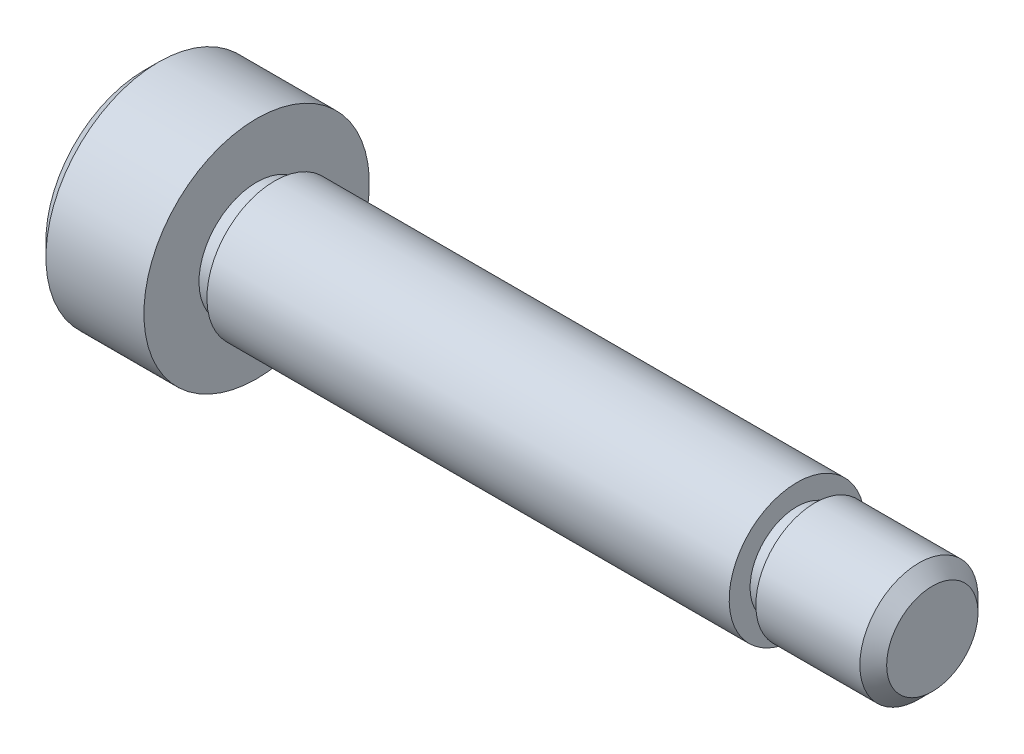
ISO-10303-21;
HEADER;
FILE_DESCRIPTION(('STEP AP214'),'2;1');
FILE_NAME('part.step','',(''),(''),'','','');
FILE_SCHEMA(('AUTOMOTIVE_DESIGN { 1 0 10303 214 1 1 1 1 }'));
ENDSEC;
DATA;
#1=APPLICATION_CONTEXT('core data for automotive mechanical design processes');
#2=APPLICATION_PROTOCOL_DEFINITION('international standard','automotive_design',2000,#1);
#3=PRODUCT_CONTEXT('',#1,'mechanical');
#4=PRODUCT('Part','Part','',(#3));
#5=PRODUCT_RELATED_PRODUCT_CATEGORY('part','',(#4));
#6=PRODUCT_DEFINITION_FORMATION('','',#4);
#7=PRODUCT_DEFINITION_CONTEXT('part definition',#1,'design');
#8=PRODUCT_DEFINITION('design','',#6,#7);
#9=PRODUCT_DEFINITION_SHAPE('','',#8);
#10=(LENGTH_UNIT() NAMED_UNIT(*) SI_UNIT(.MILLI.,.METRE.));
#11=(NAMED_UNIT(*) PLANE_ANGLE_UNIT() SI_UNIT($,.RADIAN.));
#12=(NAMED_UNIT(*) SI_UNIT($,.STERADIAN.) SOLID_ANGLE_UNIT());
#13=UNCERTAINTY_MEASURE_WITH_UNIT(LENGTH_MEASURE(1.E-05),#10,'distance_accuracy_value','');
#14=(GEOMETRIC_REPRESENTATION_CONTEXT(3) GLOBAL_UNCERTAINTY_ASSIGNED_CONTEXT((#13)) GLOBAL_UNIT_ASSIGNED_CONTEXT((#10,
#11,#12)) REPRESENTATION_CONTEXT('',''));
#15=CARTESIAN_POINT('',(0.,0.,0.));
#16=DIRECTION('',(0.,0.,1.));
#17=DIRECTION('',(1.,0.,0.));
#18=AXIS2_PLACEMENT_3D('',#15,#16,#17);
#19=CARTESIAN_POINT('',(0.,0.,0.));
#20=DIRECTION('',(-1.,0.,0.));
#21=DIRECTION('',(0.,-1.,0.));
#22=AXIS2_PLACEMENT_3D('',#19,#20,#21);
#23=PLANE('',#22);
#24=DIRECTION('',(0.,0.866025403784439,0.5));
#25=VECTOR('',#24,1.);
#26=CARTESIAN_POINT('',(0.,-1.1811,0.681908402939868));
#27=LINE('',#26,#25);
#28=CARTESIAN_POINT('',(0.,-1.1811,0.681908402939868));
#29=VERTEX_POINT('',#28);
#30=CARTESIAN_POINT('',(0.,0.,1.36381680587973));
#31=VERTEX_POINT('',#30);
#32=EDGE_CURVE('E76',#29,#31,#27,.T.);
#33=ORIENTED_EDGE('',*,*,#32,.F.);
#34=DIRECTION('',(0.,0.,1.));
#35=VECTOR('',#34,1.);
#36=CARTESIAN_POINT('',(0.,-1.1811,-0.681908402939867));
#37=LINE('',#36,#35);
#38=CARTESIAN_POINT('',(0.,-1.1811,-0.681908402939867));
#39=VERTEX_POINT('',#38);
#40=EDGE_CURVE('E170',#39,#29,#37,.T.);
#41=ORIENTED_EDGE('',*,*,#40,.F.);
#42=DIRECTION('',(0.,-0.866025403784439,0.5));
#43=VECTOR('',#42,1.);
#44=CARTESIAN_POINT('',(0.,0.,-1.36381680587973));
#45=LINE('',#44,#43);
#46=CARTESIAN_POINT('',(0.,0.,-1.36381680587973));
#47=VERTEX_POINT('',#46);
#48=EDGE_CURVE('E167',#47,#39,#45,.T.);
#49=ORIENTED_EDGE('',*,*,#48,.F.);
#50=DIRECTION('',(0.,-0.866025403784439,-0.5));
#51=VECTOR('',#50,1.);
#52=CARTESIAN_POINT('',(0.,1.1811,-0.681908402939867));
#53=LINE('',#52,#51);
#54=CARTESIAN_POINT('',(0.,1.1811,-0.681908402939867));
#55=VERTEX_POINT('',#54);
#56=EDGE_CURVE('E124',#55,#47,#53,.T.);
#57=ORIENTED_EDGE('',*,*,#56,.F.);
#58=DIRECTION('',(0.,0.,-1.));
#59=VECTOR('',#58,1.);
#60=CARTESIAN_POINT('',(0.,1.1811,0.681908402939867));
#61=LINE('',#60,#59);
#62=CARTESIAN_POINT('',(0.,1.1811,0.681908402939867));
#63=VERTEX_POINT('',#62);
#64=EDGE_CURVE('E161',#63,#55,#61,.T.);
#65=ORIENTED_EDGE('',*,*,#64,.F.);
#66=DIRECTION('',(0.,0.866025403784439,-0.5));
#67=VECTOR('',#66,1.);
#68=CARTESIAN_POINT('',(0.,0.,1.36381680587973));
#69=LINE('',#68,#67);
#70=EDGE_CURVE('E157',#31,#63,#69,.T.);
#71=ORIENTED_EDGE('',*,*,#70,.F.);
#72=EDGE_LOOP('',(#33,#41,#49,#57,#65,#71));
#73=FACE_BOUND('',#72,.T.);
#74=CARTESIAN_POINT('',(0.,0.,0.));
#75=DIRECTION('',(1.,0.,0.));
#76=DIRECTION('',(0.,1.,0.));
#77=AXIS2_PLACEMENT_3D('',#74,#75,#76);
#78=CIRCLE('',#77,3.4671);
#79=CARTESIAN_POINT('',(0.,3.4671,0.));
#80=VERTEX_POINT('',#79);
#81=EDGE_CURVE('E13',#80,#80,#78,.T.);
#82=ORIENTED_EDGE('',*,*,#81,.F.);
#83=EDGE_LOOP('',(#82));
#84=FACE_BOUND('',#83,.T.);
#85=ADVANCED_FACE('F61',(#73,#84),#23,.T.);
#86=CARTESIAN_POINT('',(0.508000000000002,0.,0.));
#87=DIRECTION('',(1.,0.,0.));
#88=DIRECTION('',(0.,1.,0.));
#89=AXIS2_PLACEMENT_3D('',#86,#87,#88);
#90=CONICAL_SURFACE('',#89,3.9751,0.785398163397447);
#91=ORIENTED_EDGE('',*,*,#81,.T.);
#92=EDGE_LOOP('',(#91));
#93=FACE_BOUND('',#92,.T.);
#94=CARTESIAN_POINT('',(0.508000000000002,0.,0.));
#95=DIRECTION('',(1.,0.,0.));
#96=DIRECTION('',(0.,1.,0.));
#97=AXIS2_PLACEMENT_3D('',#94,#95,#96);
#98=CIRCLE('',#97,3.9751);
#99=CARTESIAN_POINT('',(0.508000000000001,3.9751,0.));
#100=VERTEX_POINT('',#99);
#101=EDGE_CURVE('E69',#100,#100,#98,.T.);
#102=ORIENTED_EDGE('',*,*,#101,.F.);
#103=EDGE_LOOP('',(#102));
#104=FACE_BOUND('',#103,.T.);
#105=ADVANCED_FACE('F232',(#93,#104),#90,.T.);
#106=CARTESIAN_POINT('',(27.7876,0.,0.));
#107=DIRECTION('',(1.,0.,0.));
#108=DIRECTION('',(0.,1.,0.));
#109=AXIS2_PLACEMENT_3D('',#106,#107,#108);
#110=CYLINDRICAL_SURFACE('',#109,3.9751);
#111=ORIENTED_EDGE('',*,*,#101,.T.);
#112=EDGE_LOOP('',(#111));
#113=FACE_BOUND('',#112,.T.);
#114=CARTESIAN_POINT('',(3.9624,0.,0.));
#115=DIRECTION('',(1.,0.,0.));
#116=DIRECTION('',(0.,1.,0.));
#117=AXIS2_PLACEMENT_3D('',#114,#115,#116);
#118=CIRCLE('',#117,3.9751);
#119=CARTESIAN_POINT('',(3.9624,3.9751,0.));
#120=VERTEX_POINT('',#119);
#121=EDGE_CURVE('E221',#120,#120,#118,.T.);
#122=ORIENTED_EDGE('',*,*,#121,.F.);
#123=EDGE_LOOP('',(#122));
#124=FACE_BOUND('',#123,.T.);
#125=ADVANCED_FACE('F229',(#113,#124),#110,.T.);
#126=CARTESIAN_POINT('',(3.9624,3.9751,0.));
#127=DIRECTION('',(1.,0.,0.));
#128=DIRECTION('',(0.,1.,0.));
#129=AXIS2_PLACEMENT_3D('',#126,#127,#128);
#130=PLANE('',#129);
#131=ORIENTED_EDGE('',*,*,#121,.T.);
#132=EDGE_LOOP('',(#131));
#133=FACE_BOUND('',#132,.T.);
#134=CARTESIAN_POINT('',(3.9624,0.,0.));
#135=DIRECTION('',(1.,0.,0.));
#136=DIRECTION('',(0.,1.,0.));
#137=AXIS2_PLACEMENT_3D('',#134,#135,#136);
#138=CIRCLE('',#137,2.032);
#139=CARTESIAN_POINT('',(3.9624,2.032,0.));
#140=VERTEX_POINT('',#139);
#141=EDGE_CURVE('E217',#140,#140,#138,.T.);
#142=ORIENTED_EDGE('',*,*,#141,.F.);
#143=EDGE_LOOP('',(#142));
#144=FACE_BOUND('',#143,.T.);
#145=ADVANCED_FACE('F238',(#133,#144),#130,.T.);
#146=CARTESIAN_POINT('',(27.7876,0.,0.));
#147=DIRECTION('',(1.,0.,0.));
#148=DIRECTION('',(0.,1.,0.));
#149=AXIS2_PLACEMENT_3D('',#146,#147,#148);
#150=CYLINDRICAL_SURFACE('',#149,2.032);
#151=ORIENTED_EDGE('',*,*,#141,.T.);
#152=EDGE_LOOP('',(#151));
#153=FACE_BOUND('',#152,.T.);
#154=CARTESIAN_POINT('',(4.5974,0.,0.));
#155=DIRECTION('',(1.,0.,0.));
#156=DIRECTION('',(0.,1.,0.));
#157=AXIS2_PLACEMENT_3D('',#154,#155,#156);
#158=CIRCLE('',#157,2.032);
#159=CARTESIAN_POINT('',(4.5974,2.032,0.));
#160=VERTEX_POINT('',#159);
#161=EDGE_CURVE('E213',#160,#160,#158,.T.);
#162=ORIENTED_EDGE('',*,*,#161,.F.);
#163=EDGE_LOOP('',(#162));
#164=FACE_BOUND('',#163,.T.);
#165=ADVANCED_FACE('F245',(#153,#164),#150,.T.);
#166=CARTESIAN_POINT('',(4.5974,2.032,0.));
#167=DIRECTION('',(-1.,0.,0.));
#168=DIRECTION('',(0.,-1.,0.));
#169=AXIS2_PLACEMENT_3D('',#166,#167,#168);
#170=PLANE('',#169);
#171=ORIENTED_EDGE('',*,*,#161,.T.);
#172=EDGE_LOOP('',(#171));
#173=FACE_BOUND('',#172,.T.);
#174=CARTESIAN_POINT('',(4.5974,0.,0.));
#175=DIRECTION('',(1.,0.,0.));
#176=DIRECTION('',(0.,1.,0.));
#177=AXIS2_PLACEMENT_3D('',#174,#175,#176);
#178=CIRCLE('',#177,2.3876);
#179=CARTESIAN_POINT('',(4.5974,2.3876,0.));
#180=VERTEX_POINT('',#179);
#181=EDGE_CURVE('E209',#180,#180,#178,.T.);
#182=ORIENTED_EDGE('',*,*,#181,.F.);
#183=EDGE_LOOP('',(#182));
#184=FACE_BOUND('',#183,.T.);
#185=ADVANCED_FACE('F249',(#173,#184),#170,.T.);
#186=CARTESIAN_POINT('',(27.7876,0.,0.));
#187=DIRECTION('',(1.,0.,0.));
#188=DIRECTION('',(0.,1.,0.));
#189=AXIS2_PLACEMENT_3D('',#186,#187,#188);
#190=CYLINDRICAL_SURFACE('',#189,2.3876);
#191=ORIENTED_EDGE('',*,*,#181,.T.);
#192=EDGE_LOOP('',(#191));
#193=FACE_BOUND('',#192,.T.);
#194=CARTESIAN_POINT('',(23.0124,0.,0.));
#195=DIRECTION('',(1.,0.,0.));
#196=DIRECTION('',(0.,1.,0.));
#197=AXIS2_PLACEMENT_3D('',#194,#195,#196);
#198=CIRCLE('',#197,2.3876);
#199=CARTESIAN_POINT('',(23.0124,2.3876,0.));
#200=VERTEX_POINT('',#199);
#201=EDGE_CURVE('E205',#200,#200,#198,.T.);
#202=ORIENTED_EDGE('',*,*,#201,.F.);
#203=EDGE_LOOP('',(#202));
#204=FACE_BOUND('',#203,.T.);
#205=ADVANCED_FACE('F253',(#193,#204),#190,.T.);
#206=CARTESIAN_POINT('',(23.0124,2.3876,0.));
#207=DIRECTION('',(1.,0.,0.));
#208=DIRECTION('',(0.,1.,0.));
#209=AXIS2_PLACEMENT_3D('',#206,#207,#208);
#210=PLANE('',#209);
#211=ORIENTED_EDGE('',*,*,#201,.T.);
#212=EDGE_LOOP('',(#211));
#213=FACE_BOUND('',#212,.T.);
#214=CARTESIAN_POINT('',(23.0124,0.,0.));
#215=DIRECTION('',(1.,0.,0.));
#216=DIRECTION('',(0.,1.,0.));
#217=AXIS2_PLACEMENT_3D('',#214,#215,#216);
#218=CIRCLE('',#217,1.651);
#219=CARTESIAN_POINT('',(23.0124,1.651,0.));
#220=VERTEX_POINT('',#219);
#221=EDGE_CURVE('E201',#220,#220,#218,.T.);
#222=ORIENTED_EDGE('',*,*,#221,.F.);
#223=EDGE_LOOP('',(#222));
#224=FACE_BOUND('',#223,.T.);
#225=ADVANCED_FACE('F257',(#213,#224),#210,.T.);
#226=CARTESIAN_POINT('',(27.7876,0.,0.));
#227=DIRECTION('',(1.,0.,0.));
#228=DIRECTION('',(0.,1.,0.));
#229=AXIS2_PLACEMENT_3D('',#226,#227,#228);
#230=CYLINDRICAL_SURFACE('',#229,1.651);
#231=ORIENTED_EDGE('',*,*,#221,.T.);
#232=EDGE_LOOP('',(#231));
#233=FACE_BOUND('',#232,.T.);
#234=CARTESIAN_POINT('',(23.6474,0.,0.));
#235=DIRECTION('',(1.,0.,0.));
#236=DIRECTION('',(0.,1.,0.));
#237=AXIS2_PLACEMENT_3D('',#234,#235,#236);
#238=CIRCLE('',#237,1.651);
#239=CARTESIAN_POINT('',(23.6474,1.651,0.));
#240=VERTEX_POINT('',#239);
#241=EDGE_CURVE('E197',#240,#240,#238,.T.);
#242=ORIENTED_EDGE('',*,*,#241,.F.);
#243=EDGE_LOOP('',(#242));
#244=FACE_BOUND('',#243,.T.);
#245=ADVANCED_FACE('F261',(#233,#244),#230,.T.);
#246=CARTESIAN_POINT('',(23.6474,1.651,0.));
#247=DIRECTION('',(-1.,0.,0.));
#248=DIRECTION('',(0.,-1.,0.));
#249=AXIS2_PLACEMENT_3D('',#246,#247,#248);
#250=PLANE('',#249);
#251=ORIENTED_EDGE('',*,*,#241,.T.);
#252=EDGE_LOOP('',(#251));
#253=FACE_BOUND('',#252,.T.);
#254=CARTESIAN_POINT('',(23.6474,0.,0.));
#255=DIRECTION('',(1.,0.,0.));
#256=DIRECTION('',(0.,1.,0.));
#257=AXIS2_PLACEMENT_3D('',#254,#255,#256);
#258=CIRCLE('',#257,2.0828);
#259=CARTESIAN_POINT('',(23.6474,2.0828,0.));
#260=VERTEX_POINT('',#259);
#261=EDGE_CURVE('E193',#260,#260,#258,.T.);
#262=ORIENTED_EDGE('',*,*,#261,.F.);
#263=EDGE_LOOP('',(#262));
#264=FACE_BOUND('',#263,.T.);
#265=ADVANCED_FACE('F265',(#253,#264),#250,.T.);
#266=CARTESIAN_POINT('',(27.7876,0.,0.));
#267=DIRECTION('',(1.,0.,0.));
#268=DIRECTION('',(0.,1.,0.));
#269=AXIS2_PLACEMENT_3D('',#266,#267,#268);
#270=CYLINDRICAL_SURFACE('',#269,2.0828);
#271=CARTESIAN_POINT('',(27.31516,0.,0.));
#272=DIRECTION('',(-1.,0.,0.));
#273=DIRECTION('',(0.,0.,1.));
#274=AXIS2_PLACEMENT_3D('',#271,#272,#273);
#275=CIRCLE('',#274,2.0828);
#276=CARTESIAN_POINT('',(27.31516,0.,2.0828));
#277=VERTEX_POINT('',#276);
#278=EDGE_CURVE('E189',#277,#277,#275,.T.);
#279=ORIENTED_EDGE('',*,*,#278,.T.);
#280=EDGE_LOOP('',(#279));
#281=FACE_BOUND('',#280,.T.);
#282=ORIENTED_EDGE('',*,*,#261,.T.);
#283=EDGE_LOOP('',(#282));
#284=FACE_BOUND('',#283,.T.);
#285=ADVANCED_FACE('F269',(#281,#284),#270,.T.);
#286=CARTESIAN_POINT('',(27.7876,0.,0.));
#287=DIRECTION('',(-1.,0.,0.));
#288=DIRECTION('',(0.,0.,1.));
#289=AXIS2_PLACEMENT_3D('',#286,#287,#288);
#290=CONICAL_SURFACE('',#289,1.61036,0.785398163397454);
#291=ORIENTED_EDGE('',*,*,#278,.F.);
#292=EDGE_LOOP('',(#291));
#293=FACE_BOUND('',#292,.T.);
#294=CARTESIAN_POINT('',(27.7876,0.,0.));
#295=DIRECTION('',(-1.,0.,0.));
#296=DIRECTION('',(0.,0.,1.));
#297=AXIS2_PLACEMENT_3D('',#294,#295,#296);
#298=CIRCLE('',#297,1.61036);
#299=CARTESIAN_POINT('',(27.7876,0.,1.61036));
#300=VERTEX_POINT('',#299);
#301=EDGE_CURVE('E176',#300,#300,#298,.T.);
#302=ORIENTED_EDGE('',*,*,#301,.T.);
#303=EDGE_LOOP('',(#302));
#304=FACE_BOUND('',#303,.T.);
#305=ADVANCED_FACE('F273',(#293,#304),#290,.T.);
#306=CARTESIAN_POINT('',(27.7876,2.0828,0.));
#307=DIRECTION('',(1.,0.,0.));
#308=DIRECTION('',(0.,1.,0.));
#309=AXIS2_PLACEMENT_3D('',#306,#307,#308);
#310=PLANE('',#309);
#311=ORIENTED_EDGE('',*,*,#301,.F.);
#312=EDGE_LOOP('',(#311));
#313=FACE_BOUND('',#312,.T.);
#314=ADVANCED_FACE('F275',(#313),#310,.T.);
#315=CARTESIAN_POINT('',(1.1938,-1.1811,0.681908402939868));
#316=DIRECTION('',(0.,-0.5,0.866025403784439));
#317=DIRECTION('',(0.,-0.866025403784439,-0.5));
#318=AXIS2_PLACEMENT_3D('',#315,#316,#317);
#319=PLANE('',#318);
#320=ORIENTED_EDGE('',*,*,#32,.T.);
#321=DIRECTION('',(-1.,0.,0.));
#322=VECTOR('',#321,1.);
#323=CARTESIAN_POINT('',(1.1938,0.,1.36381680587973));
#324=LINE('',#323,#322);
#325=CARTESIAN_POINT('',(1.1938,0.,1.36381680587973));
#326=VERTEX_POINT('',#325);
#327=EDGE_CURVE('E106',#326,#31,#324,.T.);
#328=ORIENTED_EDGE('',*,*,#327,.F.);
#329=DIRECTION('',(0.,0.866025403784439,0.5));
#330=VECTOR('',#329,1.);
#331=CARTESIAN_POINT('',(1.1938,-1.1811,0.681908402939868));
#332=LINE('',#331,#330);
#333=CARTESIAN_POINT('',(1.1938,-1.1811,0.681908402939868));
#334=VERTEX_POINT('',#333);
#335=EDGE_CURVE('E173',#334,#326,#332,.T.);
#336=ORIENTED_EDGE('',*,*,#335,.F.);
#337=DIRECTION('',(-1.,0.,0.));
#338=VECTOR('',#337,1.);
#339=CARTESIAN_POINT('',(1.1938,-1.1811,0.681908402939868));
#340=LINE('',#339,#338);
#341=EDGE_CURVE('E84',#334,#29,#340,.T.);
#342=ORIENTED_EDGE('',*,*,#341,.T.);
#343=EDGE_LOOP('',(#320,#328,#336,#342));
#344=FACE_BOUND('',#343,.T.);
#345=ADVANCED_FACE('F278',(#344),#319,.F.);
#346=CARTESIAN_POINT('',(1.1938,-1.1811,-0.681908402939867));
#347=DIRECTION('',(0.,-1.,0.));
#348=DIRECTION('',(1.,0.,0.));
#349=AXIS2_PLACEMENT_3D('',#346,#347,#348);
#350=PLANE('',#349);
#351=ORIENTED_EDGE('',*,*,#40,.T.);
#352=ORIENTED_EDGE('',*,*,#341,.F.);
#353=DIRECTION('',(0.,0.,1.));
#354=VECTOR('',#353,1.);
#355=CARTESIAN_POINT('',(1.1938,-1.1811,-0.681908402939867));
#356=LINE('',#355,#354);
#357=CARTESIAN_POINT('',(1.1938,-1.1811,-0.681908402939867));
#358=VERTEX_POINT('',#357);
#359=EDGE_CURVE('E138',#358,#334,#356,.T.);
#360=ORIENTED_EDGE('',*,*,#359,.F.);
#361=DIRECTION('',(-1.,0.,0.));
#362=VECTOR('',#361,1.);
#363=CARTESIAN_POINT('',(1.1938,-1.1811,-0.681908402939867));
#364=LINE('',#363,#362);
#365=EDGE_CURVE('E129',#358,#39,#364,.T.);
#366=ORIENTED_EDGE('',*,*,#365,.T.);
#367=EDGE_LOOP('',(#351,#352,#360,#366));
#368=FACE_BOUND('',#367,.T.);
#369=ADVANCED_FACE('F285',(#368),#350,.F.);
#370=CARTESIAN_POINT('',(1.1938,0.,-1.36381680587973));
#371=DIRECTION('',(0.,-0.5,-0.866025403784438));
#372=DIRECTION('',(0.,0.866025403784438,-0.5));
#373=AXIS2_PLACEMENT_3D('',#370,#371,#372);
#374=PLANE('',#373);
#375=ORIENTED_EDGE('',*,*,#48,.T.);
#376=ORIENTED_EDGE('',*,*,#365,.F.);
#377=DIRECTION('',(0.,-0.866025403784439,0.5));
#378=VECTOR('',#377,1.);
#379=CARTESIAN_POINT('',(1.1938,0.,-1.36381680587973));
#380=LINE('',#379,#378);
#381=CARTESIAN_POINT('',(1.1938,0.,-1.36381680587973));
#382=VERTEX_POINT('',#381);
#383=EDGE_CURVE('E133',#382,#358,#380,.T.);
#384=ORIENTED_EDGE('',*,*,#383,.F.);
#385=DIRECTION('',(-1.,0.,0.));
#386=VECTOR('',#385,1.);
#387=CARTESIAN_POINT('',(1.1938,0.,-1.36381680587973));
#388=LINE('',#387,#386);
#389=EDGE_CURVE('E117',#382,#47,#388,.T.);
#390=ORIENTED_EDGE('',*,*,#389,.T.);
#391=EDGE_LOOP('',(#375,#376,#384,#390));
#392=FACE_BOUND('',#391,.T.);
#393=ADVANCED_FACE('F134',(#392),#374,.F.);
#394=CARTESIAN_POINT('',(1.1938,1.1811,-0.681908402939867));
#395=DIRECTION('',(0.,0.5,-0.866025403784439));
#396=DIRECTION('',(0.,0.866025403784439,0.5));
#397=AXIS2_PLACEMENT_3D('',#394,#395,#396);
#398=PLANE('',#397);
#399=ORIENTED_EDGE('',*,*,#56,.T.);
#400=ORIENTED_EDGE('',*,*,#389,.F.);
#401=DIRECTION('',(0.,-0.866025403784439,-0.5));
#402=VECTOR('',#401,1.);
#403=CARTESIAN_POINT('',(1.1938,1.1811,-0.681908402939867));
#404=LINE('',#403,#402);
#405=CARTESIAN_POINT('',(1.1938,1.1811,-0.681908402939867));
#406=VERTEX_POINT('',#405);
#407=EDGE_CURVE('E121',#406,#382,#404,.T.);
#408=ORIENTED_EDGE('',*,*,#407,.F.);
#409=DIRECTION('',(-1.,0.,0.));
#410=VECTOR('',#409,1.);
#411=CARTESIAN_POINT('',(1.1938,1.1811,-0.681908402939867));
#412=LINE('',#411,#410);
#413=EDGE_CURVE('E130',#406,#55,#412,.T.);
#414=ORIENTED_EDGE('',*,*,#413,.T.);
#415=EDGE_LOOP('',(#399,#400,#408,#414));
#416=FACE_BOUND('',#415,.T.);
#417=ADVANCED_FACE('F119',(#416),#398,.F.);
#418=CARTESIAN_POINT('',(1.1938,1.1811,0.681908402939867));
#419=DIRECTION('',(0.,1.,0.));
#420=DIRECTION('',(-1.,0.,0.));
#421=AXIS2_PLACEMENT_3D('',#418,#419,#420);
#422=PLANE('',#421);
#423=ORIENTED_EDGE('',*,*,#64,.T.);
#424=ORIENTED_EDGE('',*,*,#413,.F.);
#425=DIRECTION('',(0.,0.,-1.));
#426=VECTOR('',#425,1.);
#427=CARTESIAN_POINT('',(1.1938,1.1811,0.681908402939867));
#428=LINE('',#427,#426);
#429=CARTESIAN_POINT('',(1.1938,1.1811,0.681908402939867));
#430=VERTEX_POINT('',#429);
#431=EDGE_CURVE('E144',#430,#406,#428,.T.);
#432=ORIENTED_EDGE('',*,*,#431,.F.);
#433=DIRECTION('',(-1.,0.,0.));
#434=VECTOR('',#433,1.);
#435=CARTESIAN_POINT('',(1.1938,1.1811,0.681908402939867));
#436=LINE('',#435,#434);
#437=EDGE_CURVE('E181',#430,#63,#436,.T.);
#438=ORIENTED_EDGE('',*,*,#437,.T.);
#439=EDGE_LOOP('',(#423,#424,#432,#438));
#440=FACE_BOUND('',#439,.T.);
#441=ADVANCED_FACE('F289',(#440),#422,.F.);
#442=CARTESIAN_POINT('',(1.1938,0.,1.36381680587973));
#443=DIRECTION('',(0.,0.5,0.866025403784438));
#444=DIRECTION('',(0.,-0.866025403784439,0.5));
#445=AXIS2_PLACEMENT_3D('',#442,#443,#444);
#446=PLANE('',#445);
#447=ORIENTED_EDGE('',*,*,#70,.T.);
#448=ORIENTED_EDGE('',*,*,#437,.F.);
#449=DIRECTION('',(0.,0.866025403784439,-0.5));
#450=VECTOR('',#449,1.);
#451=CARTESIAN_POINT('',(1.1938,0.,1.36381680587973));
#452=LINE('',#451,#450);
#453=EDGE_CURVE('E149',#326,#430,#452,.T.);
#454=ORIENTED_EDGE('',*,*,#453,.F.);
#455=ORIENTED_EDGE('',*,*,#327,.T.);
#456=EDGE_LOOP('',(#447,#448,#454,#455));
#457=FACE_BOUND('',#456,.T.);
#458=ADVANCED_FACE('F286',(#457),#446,.F.);
#459=CARTESIAN_POINT('',(1.1938,0.,0.));
#460=DIRECTION('',(-1.,0.,0.));
#461=DIRECTION('',(0.,-1.,0.));
#462=AXIS2_PLACEMENT_3D('',#459,#460,#461);
#463=PLANE('',#462);
#464=ORIENTED_EDGE('',*,*,#335,.T.);
#465=ORIENTED_EDGE('',*,*,#453,.T.);
#466=ORIENTED_EDGE('',*,*,#431,.T.);
#467=ORIENTED_EDGE('',*,*,#407,.T.);
#468=ORIENTED_EDGE('',*,*,#383,.T.);
#469=ORIENTED_EDGE('',*,*,#359,.T.);
#470=EDGE_LOOP('',(#464,#465,#466,#467,#468,#469));
#471=FACE_BOUND('',#470,.T.);
#472=ADVANCED_FACE('F141',(#471),#463,.T.);
#473=CLOSED_SHELL('',(#85,#105,#125,#145,#165,#185,#205,#225,#245,#265,#285,#305,#314,#345,#369,
#393,#417,#441,#458,#472));
#474=MANIFOLD_SOLID_BREP('B2',#473);
#475=ADVANCED_BREP_SHAPE_REPRESENTATION('',(#18,#474),#14);
#476=SHAPE_DEFINITION_REPRESENTATION(#9,#475);
ENDSEC;
END-ISO-10303-21;
